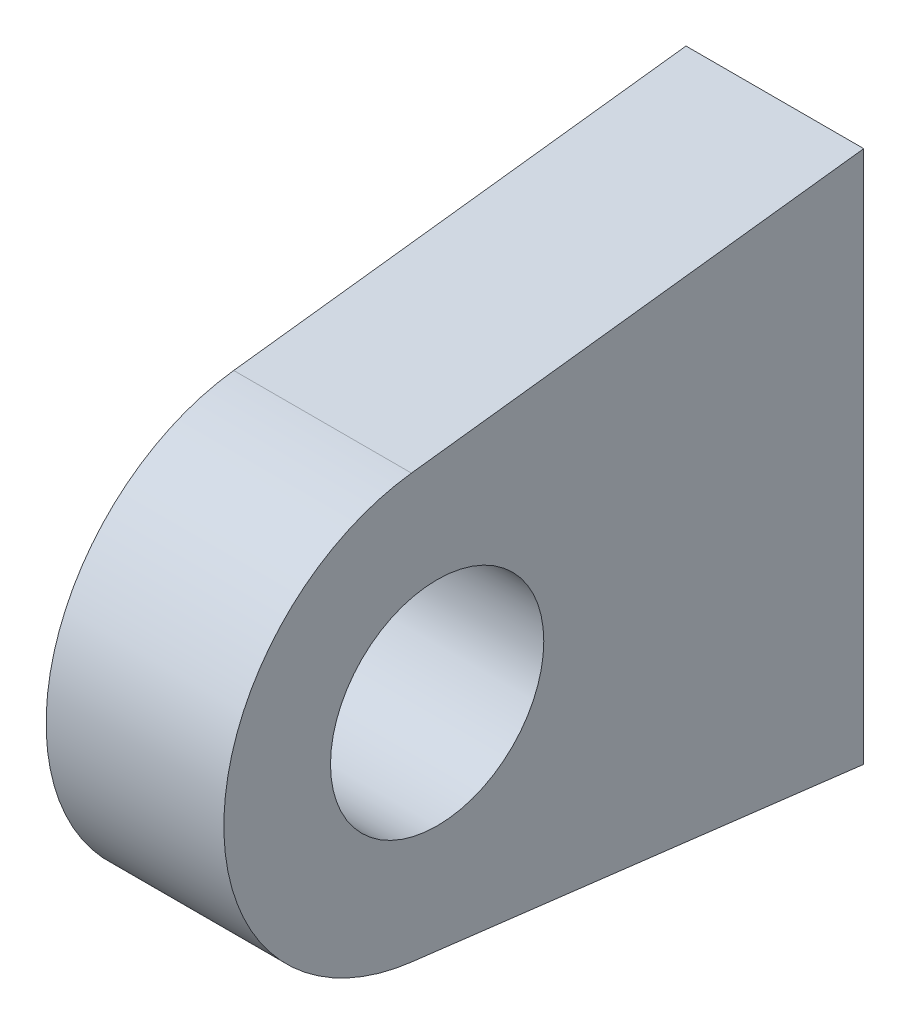
ISO-10303-21;
HEADER;
FILE_DESCRIPTION(('STEP AP214'),'2;1');
FILE_NAME('part.step','',(''),(''),'','','');
FILE_SCHEMA(('AUTOMOTIVE_DESIGN { 1 0 10303 214 1 1 1 1 }'));
ENDSEC;
DATA;
#1=APPLICATION_CONTEXT('core data for automotive mechanical design processes');
#2=APPLICATION_PROTOCOL_DEFINITION('international standard','automotive_design',2000,#1);
#3=PRODUCT_CONTEXT('',#1,'mechanical');
#4=PRODUCT('Part','Part','',(#3));
#5=PRODUCT_RELATED_PRODUCT_CATEGORY('part','',(#4));
#6=PRODUCT_DEFINITION_FORMATION('','',#4);
#7=PRODUCT_DEFINITION_CONTEXT('part definition',#1,'design');
#8=PRODUCT_DEFINITION('design','',#6,#7);
#9=PRODUCT_DEFINITION_SHAPE('','',#8);
#10=(LENGTH_UNIT() NAMED_UNIT(*) SI_UNIT(.MILLI.,.METRE.));
#11=(NAMED_UNIT(*) PLANE_ANGLE_UNIT() SI_UNIT($,.RADIAN.));
#12=(NAMED_UNIT(*) SI_UNIT($,.STERADIAN.) SOLID_ANGLE_UNIT());
#13=UNCERTAINTY_MEASURE_WITH_UNIT(LENGTH_MEASURE(1.E-05),#10,'distance_accuracy_value','');
#14=(GEOMETRIC_REPRESENTATION_CONTEXT(3) GLOBAL_UNCERTAINTY_ASSIGNED_CONTEXT((#13)) GLOBAL_UNIT_ASSIGNED_CONTEXT((#10,
#11,#12)) REPRESENTATION_CONTEXT('',''));
#15=CARTESIAN_POINT('',(0.,0.,0.));
#16=DIRECTION('',(0.,0.,1.));
#17=DIRECTION('',(1.,0.,0.));
#18=AXIS2_PLACEMENT_3D('',#15,#16,#17);
#19=CARTESIAN_POINT('',(2.5,7.39118911611691,0.896795305893005));
#20=DIRECTION('',(0.,-0.992719437781351,-0.120449648613344));
#21=DIRECTION('',(0.,0.120449648613344,-0.992719437781351));
#22=AXIS2_PLACEMENT_3D('',#19,#20,#21);
#23=PLANE('',#22);
#24=DIRECTION('',(0.,-0.120449648613344,0.992719437781351));
#25=VECTOR('',#24,1.);
#26=CARTESIAN_POINT('',(-2.5,7.39118911611691,0.896795305893005));
#27=LINE('',#26,#25);
#28=CARTESIAN_POINT('',(-2.5,7.5,0.));
#29=VERTEX_POINT('',#28);
#30=CARTESIAN_POINT('',(-2.5,5.95631662668811,12.7226978916801));
#31=VERTEX_POINT('',#30);
#32=EDGE_CURVE('E106',#29,#31,#27,.T.);
#33=ORIENTED_EDGE('',*,*,#32,.T.);
#34=DIRECTION('',(-1.,0.,0.));
#35=VECTOR('',#34,1.);
#36=CARTESIAN_POINT('',(2.5,5.95631662668811,12.7226978916801));
#37=LINE('',#36,#35);
#38=CARTESIAN_POINT('',(2.5,5.95631662668811,12.7226978916801));
#39=VERTEX_POINT('',#38);
#40=EDGE_CURVE('E11',#39,#31,#37,.T.);
#41=ORIENTED_EDGE('',*,*,#40,.F.);
#42=DIRECTION('',(0.,-0.120449648613344,0.992719437781351));
#43=VECTOR('',#42,1.);
#44=CARTESIAN_POINT('',(2.5,7.39118911611691,0.896795305893005));
#45=LINE('',#44,#43);
#46=CARTESIAN_POINT('',(2.5,7.5,0.));
#47=VERTEX_POINT('',#46);
#48=EDGE_CURVE('E89',#47,#39,#45,.T.);
#49=ORIENTED_EDGE('',*,*,#48,.F.);
#50=DIRECTION('',(-1.,0.,0.));
#51=VECTOR('',#50,1.);
#52=CARTESIAN_POINT('',(2.5,7.5,0.));
#53=LINE('',#52,#51);
#54=EDGE_CURVE('E56',#47,#29,#53,.T.);
#55=ORIENTED_EDGE('',*,*,#54,.T.);
#56=EDGE_LOOP('',(#33,#41,#49,#55));
#57=FACE_BOUND('',#56,.T.);
#58=ADVANCED_FACE('F39',(#57),#23,.F.);
#59=CARTESIAN_POINT('',(2.5,0.,12.));
#60=DIRECTION('',(-1.,0.,0.));
#61=DIRECTION('',(0.,0.,1.));
#62=AXIS2_PLACEMENT_3D('',#59,#60,#61);
#63=CYLINDRICAL_SURFACE('',#62,6.);
#64=CARTESIAN_POINT('',(-2.5,0.,12.));
#65=DIRECTION('',(1.,0.,0.));
#66=DIRECTION('',(0.,0.,-1.));
#67=AXIS2_PLACEMENT_3D('',#64,#65,#66);
#68=CIRCLE('',#67,6.);
#69=CARTESIAN_POINT('',(-2.5,-5.95631662668811,12.7226978916801));
#70=VERTEX_POINT('',#69);
#71=EDGE_CURVE('E94',#31,#70,#68,.T.);
#72=ORIENTED_EDGE('',*,*,#71,.T.);
#73=DIRECTION('',(-1.,0.,0.));
#74=VECTOR('',#73,1.);
#75=CARTESIAN_POINT('',(2.5,-5.95631662668811,12.7226978916801));
#76=LINE('',#75,#74);
#77=CARTESIAN_POINT('',(2.5,-5.95631662668811,12.7226978916801));
#78=VERTEX_POINT('',#77);
#79=EDGE_CURVE('E48',#78,#70,#76,.T.);
#80=ORIENTED_EDGE('',*,*,#79,.F.);
#81=CARTESIAN_POINT('',(2.5,0.,12.));
#82=DIRECTION('',(1.,0.,0.));
#83=DIRECTION('',(0.,0.,-1.));
#84=AXIS2_PLACEMENT_3D('',#81,#82,#83);
#85=CIRCLE('',#84,6.);
#86=EDGE_CURVE('E81',#39,#78,#85,.T.);
#87=ORIENTED_EDGE('',*,*,#86,.F.);
#88=ORIENTED_EDGE('',*,*,#40,.T.);
#89=EDGE_LOOP('',(#72,#80,#87,#88));
#90=FACE_BOUND('',#89,.T.);
#91=ADVANCED_FACE('F93',(#90),#63,.T.);
#92=CARTESIAN_POINT('',(2.5,-7.39118911611691,0.896795305893005));
#93=DIRECTION('',(0.,-0.992719437781351,0.120449648613344));
#94=DIRECTION('',(0.,-0.120449648613344,-0.992719437781351));
#95=AXIS2_PLACEMENT_3D('',#92,#93,#94);
#96=PLANE('',#95);
#97=DIRECTION('',(0.,0.120449648613344,0.992719437781351));
#98=VECTOR('',#97,1.);
#99=CARTESIAN_POINT('',(-2.5,-7.39118911611691,0.896795305893005));
#100=LINE('',#99,#98);
#101=CARTESIAN_POINT('',(-2.5,-7.5,0.));
#102=VERTEX_POINT('',#101);
#103=EDGE_CURVE('E109',#102,#70,#100,.T.);
#104=ORIENTED_EDGE('',*,*,#103,.F.);
#105=DIRECTION('',(-1.,0.,0.));
#106=VECTOR('',#105,1.);
#107=CARTESIAN_POINT('',(2.5,-7.5,0.));
#108=LINE('',#107,#106);
#109=CARTESIAN_POINT('',(2.5,-7.5,0.));
#110=VERTEX_POINT('',#109);
#111=EDGE_CURVE('E70',#110,#102,#108,.T.);
#112=ORIENTED_EDGE('',*,*,#111,.F.);
#113=DIRECTION('',(0.,0.120449648613344,0.992719437781351));
#114=VECTOR('',#113,1.);
#115=CARTESIAN_POINT('',(2.5,-7.39118911611691,0.896795305893005));
#116=LINE('',#115,#114);
#117=EDGE_CURVE('E88',#110,#78,#116,.T.);
#118=ORIENTED_EDGE('',*,*,#117,.T.);
#119=ORIENTED_EDGE('',*,*,#79,.T.);
#120=EDGE_LOOP('',(#104,#112,#118,#119));
#121=FACE_BOUND('',#120,.T.);
#122=ADVANCED_FACE('F97',(#121),#96,.T.);
#123=CARTESIAN_POINT('',(2.5,0.,12.));
#124=DIRECTION('',(-1.,0.,0.));
#125=DIRECTION('',(0.,0.,1.));
#126=AXIS2_PLACEMENT_3D('',#123,#124,#125);
#127=CYLINDRICAL_SURFACE('',#126,3.);
#128=CARTESIAN_POINT('',(2.5,0.,12.));
#129=DIRECTION('',(1.,0.,0.));
#130=DIRECTION('',(0.,0.,-1.));
#131=AXIS2_PLACEMENT_3D('',#128,#129,#130);
#132=CIRCLE('',#131,3.);
#133=CARTESIAN_POINT('',(2.5,0.,9.));
#134=VERTEX_POINT('',#133);
#135=EDGE_CURVE('E114',#134,#134,#132,.T.);
#136=ORIENTED_EDGE('',*,*,#135,.T.);
#137=EDGE_LOOP('',(#136));
#138=FACE_BOUND('',#137,.T.);
#139=CARTESIAN_POINT('',(-2.5,0.,12.));
#140=DIRECTION('',(1.,0.,0.));
#141=DIRECTION('',(0.,0.,-1.));
#142=AXIS2_PLACEMENT_3D('',#139,#140,#141);
#143=CIRCLE('',#142,3.);
#144=CARTESIAN_POINT('',(-2.5,0.,9.));
#145=VERTEX_POINT('',#144);
#146=EDGE_CURVE('E103',#145,#145,#143,.T.);
#147=ORIENTED_EDGE('',*,*,#146,.F.);
#148=EDGE_LOOP('',(#147));
#149=FACE_BOUND('',#148,.T.);
#150=ADVANCED_FACE('F41',(#138,#149),#127,.F.);
#151=CARTESIAN_POINT('',(2.5,0.,0.));
#152=DIRECTION('',(0.,0.,-1.));
#153=DIRECTION('',(-1.,0.,0.));
#154=AXIS2_PLACEMENT_3D('',#151,#152,#153);
#155=PLANE('',#154);
#156=DIRECTION('',(0.,-1.,0.));
#157=VECTOR('',#156,1.);
#158=CARTESIAN_POINT('',(-2.5,0.,0.));
#159=LINE('',#158,#157);
#160=EDGE_CURVE('E111',#29,#102,#159,.T.);
#161=ORIENTED_EDGE('',*,*,#160,.F.);
#162=ORIENTED_EDGE('',*,*,#54,.F.);
#163=DIRECTION('',(0.,-1.,0.));
#164=VECTOR('',#163,1.);
#165=CARTESIAN_POINT('',(2.5,0.,0.));
#166=LINE('',#165,#164);
#167=EDGE_CURVE('E98',#47,#110,#166,.T.);
#168=ORIENTED_EDGE('',*,*,#167,.T.);
#169=ORIENTED_EDGE('',*,*,#111,.T.);
#170=EDGE_LOOP('',(#161,#162,#168,#169));
#171=FACE_BOUND('',#170,.T.);
#172=ADVANCED_FACE('F125',(#171),#155,.T.);
#173=CARTESIAN_POINT('',(2.5,0.,0.));
#174=DIRECTION('',(1.,0.,0.));
#175=DIRECTION('',(0.,0.,-1.));
#176=AXIS2_PLACEMENT_3D('',#173,#174,#175);
#177=PLANE('',#176);
#178=ORIENTED_EDGE('',*,*,#135,.F.);
#179=EDGE_LOOP('',(#178));
#180=FACE_BOUND('',#179,.T.);
#181=ORIENTED_EDGE('',*,*,#48,.T.);
#182=ORIENTED_EDGE('',*,*,#86,.T.);
#183=ORIENTED_EDGE('',*,*,#117,.F.);
#184=ORIENTED_EDGE('',*,*,#167,.F.);
#185=EDGE_LOOP('',(#181,#182,#183,#184));
#186=FACE_BOUND('',#185,.T.);
#187=ADVANCED_FACE('F85',(#180,#186),#177,.T.);
#188=CARTESIAN_POINT('',(-2.5,0.,0.));
#189=DIRECTION('',(1.,0.,0.));
#190=DIRECTION('',(0.,0.,-1.));
#191=AXIS2_PLACEMENT_3D('',#188,#189,#190);
#192=PLANE('',#191);
#193=ORIENTED_EDGE('',*,*,#146,.T.);
#194=EDGE_LOOP('',(#193));
#195=FACE_BOUND('',#194,.T.);
#196=ORIENTED_EDGE('',*,*,#32,.F.);
#197=ORIENTED_EDGE('',*,*,#160,.T.);
#198=ORIENTED_EDGE('',*,*,#103,.T.);
#199=ORIENTED_EDGE('',*,*,#71,.F.);
#200=EDGE_LOOP('',(#196,#197,#198,#199));
#201=FACE_BOUND('',#200,.T.);
#202=ADVANCED_FACE('F124',(#195,#201),#192,.F.);
#203=CLOSED_SHELL('',(#58,#91,#122,#150,#172,#187,#202));
#204=MANIFOLD_SOLID_BREP('B2',#203);
#205=ADVANCED_BREP_SHAPE_REPRESENTATION('',(#18,#204),#14);
#206=SHAPE_DEFINITION_REPRESENTATION(#9,#205);
ENDSEC;
END-ISO-10303-21;
